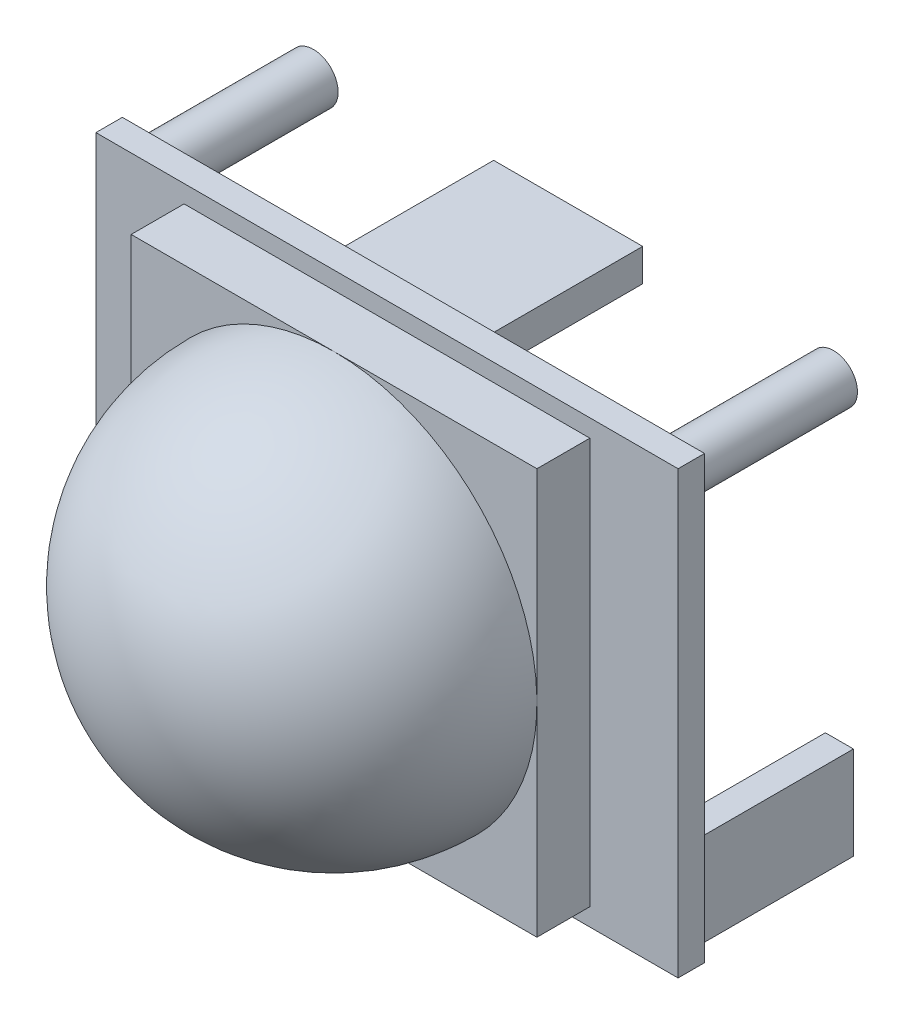
ISO-10303-21;
HEADER;
FILE_DESCRIPTION(('STEP AP214'),'2;1');
FILE_NAME('part.step','',(''),(''),'','','');
FILE_SCHEMA(('AUTOMOTIVE_DESIGN { 1 0 10303 214 1 1 1 1 }'));
ENDSEC;
DATA;
#1=APPLICATION_CONTEXT('core data for automotive mechanical design processes');
#2=APPLICATION_PROTOCOL_DEFINITION('international standard','automotive_design',2000,#1);
#3=PRODUCT_CONTEXT('',#1,'mechanical');
#4=PRODUCT('Part','Part','',(#3));
#5=PRODUCT_RELATED_PRODUCT_CATEGORY('part','',(#4));
#6=PRODUCT_DEFINITION_FORMATION('','',#4);
#7=PRODUCT_DEFINITION_CONTEXT('part definition',#1,'design');
#8=PRODUCT_DEFINITION('design','',#6,#7);
#9=PRODUCT_DEFINITION_SHAPE('','',#8);
#10=(LENGTH_UNIT() NAMED_UNIT(*) SI_UNIT(.MILLI.,.METRE.));
#11=(NAMED_UNIT(*) PLANE_ANGLE_UNIT() SI_UNIT($,.RADIAN.));
#12=(NAMED_UNIT(*) SI_UNIT($,.STERADIAN.) SOLID_ANGLE_UNIT());
#13=UNCERTAINTY_MEASURE_WITH_UNIT(LENGTH_MEASURE(1.E-05),#10,'distance_accuracy_value','');
#14=(GEOMETRIC_REPRESENTATION_CONTEXT(3) GLOBAL_UNCERTAINTY_ASSIGNED_CONTEXT((#13)) GLOBAL_UNIT_ASSIGNED_CONTEXT((#10,
#11,#12)) REPRESENTATION_CONTEXT('',''));
#15=CARTESIAN_POINT('',(0.,0.,0.));
#16=DIRECTION('',(0.,0.,1.));
#17=DIRECTION('',(1.,0.,0.));
#18=AXIS2_PLACEMENT_3D('',#15,#16,#17);
#19=CARTESIAN_POINT('',(0.,0.,13.5378110188714));
#20=DIRECTION('',(0.,0.,-1.));
#21=DIRECTION('',(-1.,0.,0.));
#22=AXIS2_PLACEMENT_3D('',#19,#20,#21);
#23=CONICAL_SURFACE('',#22,0.,1.56750842395822);
#24=CARTESIAN_POINT('',(0.,0.,13.5));
#25=DIRECTION('',(0.,0.,-1.));
#26=DIRECTION('',(-1.,0.,0.));
#27=AXIS2_PLACEMENT_3D('',#24,#25,#26);
#28=CIRCLE('',#27,11.5);
#29=CARTESIAN_POINT('',(-11.5,0.,13.5));
#30=VERTEX_POINT('',#29);
#31=EDGE_CURVE('E12',#30,#30,#28,.T.);
#32=ORIENTED_EDGE('',*,*,#31,.T.);
#33=EDGE_LOOP('',(#32));
#34=FACE_BOUND('',#33,.T.);
#35=CARTESIAN_POINT('',(0.,0.,13.5378110188714));
#36=VERTEX_POINT('',#35);
#37=VERTEX_LOOP('',#36);
#38=FACE_BOUND('',#37,.T.);
#39=ADVANCED_FACE('F47',(#34,#38),#23,.F.);
#40=CARTESIAN_POINT('',(0.,0.,13.5378110188714));
#41=DIRECTION('',(0.,0.,-1.));
#42=DIRECTION('',(0.,1.,0.));
#43=AXIS2_PLACEMENT_3D('',#40,#41,#42);
#44=SPHERICAL_SURFACE('',#43,11.5000621595341);
#45=ORIENTED_EDGE('',*,*,#31,.F.);
#46=EDGE_LOOP('',(#45));
#47=FACE_BOUND('',#46,.T.);
#48=ADVANCED_FACE('F55',(#47),#44,.T.);
#49=CLOSED_SHELL('',(#39,#48));
#50=MANIFOLD_SOLID_BREP('B2',#49);
#51=CARTESIAN_POINT('',(16.5,12.5,10.5));
#52=DIRECTION('',(-1.,0.,0.));
#53=DIRECTION('',(0.,-1.,0.));
#54=AXIS2_PLACEMENT_3D('',#51,#52,#53);
#55=PLANE('',#54);
#56=DIRECTION('',(0.,-1.,0.));
#57=VECTOR('',#56,1.);
#58=CARTESIAN_POINT('',(16.5,12.5,9.));
#59=LINE('',#58,#57);
#60=CARTESIAN_POINT('',(16.5,12.5,9.));
#61=VERTEX_POINT('',#60);
#62=CARTESIAN_POINT('',(16.5,-12.5,9.));
#63=VERTEX_POINT('',#62);
#64=EDGE_CURVE('E89',#61,#63,#59,.T.);
#65=ORIENTED_EDGE('',*,*,#64,.F.);
#66=DIRECTION('',(0.,0.,-1.));
#67=VECTOR('',#66,1.);
#68=CARTESIAN_POINT('',(16.5,12.5,10.5));
#69=LINE('',#68,#67);
#70=CARTESIAN_POINT('',(16.5,12.5,10.5));
#71=VERTEX_POINT('',#70);
#72=EDGE_CURVE('E45',#71,#61,#69,.T.);
#73=ORIENTED_EDGE('',*,*,#72,.F.);
#74=DIRECTION('',(0.,1.,0.));
#75=VECTOR('',#74,1.);
#76=CARTESIAN_POINT('',(16.5,12.5,10.5));
#77=LINE('',#76,#75);
#78=CARTESIAN_POINT('',(16.5,-12.5,10.5));
#79=VERTEX_POINT('',#78);
#80=EDGE_CURVE('E440',#79,#71,#77,.T.);
#81=ORIENTED_EDGE('',*,*,#80,.F.);
#82=DIRECTION('',(0.,0.,-1.));
#83=VECTOR('',#82,1.);
#84=CARTESIAN_POINT('',(16.5,-12.5,10.5));
#85=LINE('',#84,#83);
#86=EDGE_CURVE('E449',#79,#63,#85,.T.);
#87=ORIENTED_EDGE('',*,*,#86,.T.);
#88=EDGE_LOOP('',(#65,#73,#81,#87));
#89=FACE_BOUND('',#88,.T.);
#90=ADVANCED_FACE('F75',(#89),#55,.F.);
#91=CARTESIAN_POINT('',(-16.5,12.5,10.5));
#92=DIRECTION('',(0.,-1.,0.));
#93=DIRECTION('',(0.,0.,-1.));
#94=AXIS2_PLACEMENT_3D('',#91,#92,#93);
#95=PLANE('',#94);
#96=DIRECTION('',(1.,0.,0.));
#97=VECTOR('',#96,1.);
#98=CARTESIAN_POINT('',(16.5,12.5,9.));
#99=LINE('',#98,#97);
#100=CARTESIAN_POINT('',(-16.5,12.5,9.));
#101=VERTEX_POINT('',#100);
#102=EDGE_CURVE('E405',#101,#61,#99,.T.);
#103=ORIENTED_EDGE('',*,*,#102,.F.);
#104=DIRECTION('',(0.,0.,-1.));
#105=VECTOR('',#104,1.);
#106=CARTESIAN_POINT('',(-16.5,12.5,10.5));
#107=LINE('',#106,#105);
#108=CARTESIAN_POINT('',(-16.5,12.5,10.5));
#109=VERTEX_POINT('',#108);
#110=EDGE_CURVE('E82',#109,#101,#107,.T.);
#111=ORIENTED_EDGE('',*,*,#110,.F.);
#112=DIRECTION('',(-1.,0.,0.));
#113=VECTOR('',#112,1.);
#114=CARTESIAN_POINT('',(-16.5,12.5,10.5));
#115=LINE('',#114,#113);
#116=EDGE_CURVE('E443',#71,#109,#115,.T.);
#117=ORIENTED_EDGE('',*,*,#116,.F.);
#118=ORIENTED_EDGE('',*,*,#72,.T.);
#119=EDGE_LOOP('',(#103,#111,#117,#118));
#120=FACE_BOUND('',#119,.T.);
#121=ADVANCED_FACE('F463',(#120),#95,.F.);
#122=CARTESIAN_POINT('',(-16.5,12.5,10.5));
#123=DIRECTION('',(1.,0.,0.));
#124=DIRECTION('',(0.,1.,0.));
#125=AXIS2_PLACEMENT_3D('',#122,#123,#124);
#126=PLANE('',#125);
#127=DIRECTION('',(0.,1.,0.));
#128=VECTOR('',#127,1.);
#129=CARTESIAN_POINT('',(-16.5,12.5,9.));
#130=LINE('',#129,#128);
#131=CARTESIAN_POINT('',(-16.5,-12.5,9.));
#132=VERTEX_POINT('',#131);
#133=EDGE_CURVE('E403',#132,#101,#130,.T.);
#134=ORIENTED_EDGE('',*,*,#133,.F.);
#135=DIRECTION('',(0.,0.,-1.));
#136=VECTOR('',#135,1.);
#137=CARTESIAN_POINT('',(-16.5,-12.5,10.5));
#138=LINE('',#137,#136);
#139=CARTESIAN_POINT('',(-16.5,-12.5,10.5));
#140=VERTEX_POINT('',#139);
#141=EDGE_CURVE('E452',#140,#132,#138,.T.);
#142=ORIENTED_EDGE('',*,*,#141,.F.);
#143=DIRECTION('',(0.,-1.,0.));
#144=VECTOR('',#143,1.);
#145=CARTESIAN_POINT('',(-16.5,12.5,10.5));
#146=LINE('',#145,#144);
#147=EDGE_CURVE('E445',#109,#140,#146,.T.);
#148=ORIENTED_EDGE('',*,*,#147,.F.);
#149=ORIENTED_EDGE('',*,*,#110,.T.);
#150=EDGE_LOOP('',(#134,#142,#148,#149));
#151=FACE_BOUND('',#150,.T.);
#152=ADVANCED_FACE('F459',(#151),#126,.F.);
#153=CARTESIAN_POINT('',(-16.5,-12.5,10.5));
#154=DIRECTION('',(0.,1.,0.));
#155=DIRECTION('',(0.,0.,1.));
#156=AXIS2_PLACEMENT_3D('',#153,#154,#155);
#157=PLANE('',#156);
#158=DIRECTION('',(-1.,0.,0.));
#159=VECTOR('',#158,1.);
#160=CARTESIAN_POINT('',(16.5,-12.5,9.));
#161=LINE('',#160,#159);
#162=EDGE_CURVE('E401',#63,#132,#161,.T.);
#163=ORIENTED_EDGE('',*,*,#162,.F.);
#164=ORIENTED_EDGE('',*,*,#86,.F.);
#165=DIRECTION('',(1.,0.,0.));
#166=VECTOR('',#165,1.);
#167=CARTESIAN_POINT('',(-16.5,-12.5,10.5));
#168=LINE('',#167,#166);
#169=EDGE_CURVE('E447',#140,#79,#168,.T.);
#170=ORIENTED_EDGE('',*,*,#169,.F.);
#171=ORIENTED_EDGE('',*,*,#141,.T.);
#172=EDGE_LOOP('',(#163,#164,#170,#171));
#173=FACE_BOUND('',#172,.T.);
#174=ADVANCED_FACE('F470',(#173),#157,.F.);
#175=CARTESIAN_POINT('',(0.,0.,10.5));
#176=DIRECTION('',(0.,0.,1.));
#177=DIRECTION('',(1.,0.,0.));
#178=AXIS2_PLACEMENT_3D('',#175,#176,#177);
#179=PLANE('',#178);
#180=DIRECTION('',(0.,1.,0.));
#181=VECTOR('',#180,1.);
#182=CARTESIAN_POINT('',(11.5,11.5,10.5));
#183=LINE('',#182,#181);
#184=CARTESIAN_POINT('',(11.5,-11.5,10.5));
#185=VERTEX_POINT('',#184);
#186=CARTESIAN_POINT('',(11.5,11.5,10.5));
#187=VERTEX_POINT('',#186);
#188=EDGE_CURVE('E407',#185,#187,#183,.T.);
#189=ORIENTED_EDGE('',*,*,#188,.F.);
#190=DIRECTION('',(1.,0.,0.));
#191=VECTOR('',#190,1.);
#192=CARTESIAN_POINT('',(-11.5,-11.5,10.5));
#193=LINE('',#192,#191);
#194=CARTESIAN_POINT('',(-11.5,-11.5,10.5));
#195=VERTEX_POINT('',#194);
#196=EDGE_CURVE('E412',#195,#185,#193,.T.);
#197=ORIENTED_EDGE('',*,*,#196,.F.);
#198=DIRECTION('',(0.,-1.,0.));
#199=VECTOR('',#198,1.);
#200=CARTESIAN_POINT('',(-11.5,11.5,10.5));
#201=LINE('',#200,#199);
#202=CARTESIAN_POINT('',(-11.5,11.5,10.5));
#203=VERTEX_POINT('',#202);
#204=EDGE_CURVE('E424',#203,#195,#201,.T.);
#205=ORIENTED_EDGE('',*,*,#204,.F.);
#206=DIRECTION('',(-1.,0.,0.));
#207=VECTOR('',#206,1.);
#208=CARTESIAN_POINT('',(-11.5,11.5,10.5));
#209=LINE('',#208,#207);
#210=EDGE_CURVE('E421',#187,#203,#209,.T.);
#211=ORIENTED_EDGE('',*,*,#210,.F.);
#212=EDGE_LOOP('',(#189,#197,#205,#211));
#213=FACE_BOUND('',#212,.T.);
#214=ORIENTED_EDGE('',*,*,#80,.T.);
#215=ORIENTED_EDGE('',*,*,#116,.T.);
#216=ORIENTED_EDGE('',*,*,#147,.T.);
#217=ORIENTED_EDGE('',*,*,#169,.T.);
#218=EDGE_LOOP('',(#214,#215,#216,#217));
#219=FACE_BOUND('',#218,.T.);
#220=ADVANCED_FACE('F472',(#213,#219),#179,.T.);
#221=CARTESIAN_POINT('',(11.5,11.5,13.5));
#222=DIRECTION('',(-1.,0.,0.));
#223=DIRECTION('',(0.,-1.,0.));
#224=AXIS2_PLACEMENT_3D('',#221,#222,#223);
#225=PLANE('',#224);
#226=ORIENTED_EDGE('',*,*,#188,.T.);
#227=DIRECTION('',(0.,0.,-1.));
#228=VECTOR('',#227,1.);
#229=CARTESIAN_POINT('',(11.5,11.5,13.5));
#230=LINE('',#229,#228);
#231=CARTESIAN_POINT('',(11.5,11.5,13.5));
#232=VERTEX_POINT('',#231);
#233=EDGE_CURVE('E437',#232,#187,#230,.T.);
#234=ORIENTED_EDGE('',*,*,#233,.F.);
#235=DIRECTION('',(0.,1.,0.));
#236=VECTOR('',#235,1.);
#237=CARTESIAN_POINT('',(11.5,11.5,13.5));
#238=LINE('',#237,#236);
#239=CARTESIAN_POINT('',(11.5,-11.5,13.5));
#240=VERTEX_POINT('',#239);
#241=EDGE_CURVE('E408',#240,#232,#238,.T.);
#242=ORIENTED_EDGE('',*,*,#241,.F.);
#243=DIRECTION('',(0.,0.,-1.));
#244=VECTOR('',#243,1.);
#245=CARTESIAN_POINT('',(11.5,-11.5,13.5));
#246=LINE('',#245,#244);
#247=EDGE_CURVE('E418',#240,#185,#246,.T.);
#248=ORIENTED_EDGE('',*,*,#247,.T.);
#249=EDGE_LOOP('',(#226,#234,#242,#248));
#250=FACE_BOUND('',#249,.T.);
#251=ADVANCED_FACE('F474',(#250),#225,.F.);
#252=CARTESIAN_POINT('',(-11.5,11.5,13.5));
#253=DIRECTION('',(0.,-1.,0.));
#254=DIRECTION('',(0.,0.,-1.));
#255=AXIS2_PLACEMENT_3D('',#252,#253,#254);
#256=PLANE('',#255);
#257=ORIENTED_EDGE('',*,*,#210,.T.);
#258=DIRECTION('',(0.,0.,-1.));
#259=VECTOR('',#258,1.);
#260=CARTESIAN_POINT('',(-11.5,11.5,13.5));
#261=LINE('',#260,#259);
#262=CARTESIAN_POINT('',(-11.5,11.5,13.5));
#263=VERTEX_POINT('',#262);
#264=EDGE_CURVE('E434',#263,#203,#261,.T.);
#265=ORIENTED_EDGE('',*,*,#264,.F.);
#266=DIRECTION('',(-1.,0.,0.));
#267=VECTOR('',#266,1.);
#268=CARTESIAN_POINT('',(-11.5,11.5,13.5));
#269=LINE('',#268,#267);
#270=EDGE_CURVE('E411',#232,#263,#269,.T.);
#271=ORIENTED_EDGE('',*,*,#270,.F.);
#272=ORIENTED_EDGE('',*,*,#233,.T.);
#273=EDGE_LOOP('',(#257,#265,#271,#272));
#274=FACE_BOUND('',#273,.T.);
#275=ADVANCED_FACE('F481',(#274),#256,.F.);
#276=CARTESIAN_POINT('',(-11.5,11.5,13.5));
#277=DIRECTION('',(1.,0.,0.));
#278=DIRECTION('',(0.,1.,0.));
#279=AXIS2_PLACEMENT_3D('',#276,#277,#278);
#280=PLANE('',#279);
#281=ORIENTED_EDGE('',*,*,#204,.T.);
#282=DIRECTION('',(0.,0.,-1.));
#283=VECTOR('',#282,1.);
#284=CARTESIAN_POINT('',(-11.5,-11.5,13.5));
#285=LINE('',#284,#283);
#286=CARTESIAN_POINT('',(-11.5,-11.5,13.5));
#287=VERTEX_POINT('',#286);
#288=EDGE_CURVE('E431',#287,#195,#285,.T.);
#289=ORIENTED_EDGE('',*,*,#288,.F.);
#290=DIRECTION('',(0.,-1.,0.));
#291=VECTOR('',#290,1.);
#292=CARTESIAN_POINT('',(-11.5,11.5,13.5));
#293=LINE('',#292,#291);
#294=EDGE_CURVE('E414',#263,#287,#293,.T.);
#295=ORIENTED_EDGE('',*,*,#294,.F.);
#296=ORIENTED_EDGE('',*,*,#264,.T.);
#297=EDGE_LOOP('',(#281,#289,#295,#296));
#298=FACE_BOUND('',#297,.T.);
#299=ADVANCED_FACE('F531',(#298),#280,.F.);
#300=CARTESIAN_POINT('',(-11.5,-11.5,13.5));
#301=DIRECTION('',(0.,1.,0.));
#302=DIRECTION('',(0.,0.,1.));
#303=AXIS2_PLACEMENT_3D('',#300,#301,#302);
#304=PLANE('',#303);
#305=ORIENTED_EDGE('',*,*,#196,.T.);
#306=ORIENTED_EDGE('',*,*,#247,.F.);
#307=DIRECTION('',(1.,0.,0.));
#308=VECTOR('',#307,1.);
#309=CARTESIAN_POINT('',(-11.5,-11.5,13.5));
#310=LINE('',#309,#308);
#311=EDGE_CURVE('E416',#287,#240,#310,.T.);
#312=ORIENTED_EDGE('',*,*,#311,.F.);
#313=ORIENTED_EDGE('',*,*,#288,.T.);
#314=EDGE_LOOP('',(#305,#306,#312,#313));
#315=FACE_BOUND('',#314,.T.);
#316=ADVANCED_FACE('F527',(#315),#304,.F.);
#317=CARTESIAN_POINT('',(0.,0.,13.5));
#318=DIRECTION('',(0.,0.,1.));
#319=DIRECTION('',(1.,0.,0.));
#320=AXIS2_PLACEMENT_3D('',#317,#318,#319);
#321=PLANE('',#320);
#322=ORIENTED_EDGE('',*,*,#241,.T.);
#323=ORIENTED_EDGE('',*,*,#270,.T.);
#324=ORIENTED_EDGE('',*,*,#294,.T.);
#325=ORIENTED_EDGE('',*,*,#311,.T.);
#326=EDGE_LOOP('',(#322,#323,#324,#325));
#327=FACE_BOUND('',#326,.T.);
#328=ADVANCED_FACE('F521',(#327),#321,.T.);
#329=CARTESIAN_POINT('',(0.,0.,9.));
#330=DIRECTION('',(0.,0.,-1.));
#331=DIRECTION('',(-1.,0.,0.));
#332=AXIS2_PLACEMENT_3D('',#329,#330,#331);
#333=PLANE('',#332);
#334=DIRECTION('',(1.,0.,0.));
#335=VECTOR('',#334,1.);
#336=CARTESIAN_POINT('',(-2.86304816678649,-9.41978193146409,9.));
#337=LINE('',#336,#335);
#338=CARTESIAN_POINT('',(-8.55379822669543,-9.41978193146409,9.));
#339=VERTEX_POINT('',#338);
#340=CARTESIAN_POINT('',(-2.86304816678649,-9.41978193146409,9.));
#341=VERTEX_POINT('',#340);
#342=EDGE_CURVE('E248',#339,#341,#337,.T.);
#343=ORIENTED_EDGE('',*,*,#342,.F.);
#344=DIRECTION('',(0.,1.,0.));
#345=VECTOR('',#344,1.);
#346=CARTESIAN_POINT('',(-8.55379822669543,-9.41978193146409,9.));
#347=LINE('',#346,#345);
#348=CARTESIAN_POINT('',(-8.55379822669543,-11.66427030913,9.));
#349=VERTEX_POINT('',#348);
#350=EDGE_CURVE('E258',#349,#339,#347,.T.);
#351=ORIENTED_EDGE('',*,*,#350,.F.);
#352=DIRECTION('',(-1.,0.,0.));
#353=VECTOR('',#352,1.);
#354=CARTESIAN_POINT('',(-2.86304816678649,-11.66427030913,9.));
#355=LINE('',#354,#353);
#356=CARTESIAN_POINT('',(-2.86304816678649,-11.66427030913,9.));
#357=VERTEX_POINT('',#356);
#358=EDGE_CURVE('E240',#357,#349,#355,.T.);
#359=ORIENTED_EDGE('',*,*,#358,.F.);
#360=DIRECTION('',(0.,-1.,0.));
#361=VECTOR('',#360,1.);
#362=CARTESIAN_POINT('',(-2.86304816678649,-9.41978193146409,9.));
#363=LINE('',#362,#361);
#364=EDGE_CURVE('E255',#341,#357,#363,.T.);
#365=ORIENTED_EDGE('',*,*,#364,.F.);
#366=EDGE_LOOP('',(#343,#351,#359,#365));
#367=FACE_BOUND('',#366,.T.);
#368=DIRECTION('',(1.,0.,0.));
#369=VECTOR('',#368,1.);
#370=CARTESIAN_POINT('',(5.40797987059669,-9.41978193146409,9.));
#371=LINE('',#370,#369);
#372=CARTESIAN_POINT('',(-0.706925473280613,-9.41978193146409,9.));
#373=VERTEX_POINT('',#372);
#374=CARTESIAN_POINT('',(5.40797987059669,-9.41978193146409,9.));
#375=VERTEX_POINT('',#374);
#376=EDGE_CURVE('E291',#373,#375,#371,.T.);
#377=ORIENTED_EDGE('',*,*,#376,.F.);
#378=DIRECTION('',(0.,1.,0.));
#379=VECTOR('',#378,1.);
#380=CARTESIAN_POINT('',(-0.706925473280613,-9.41978193146409,9.));
#381=LINE('',#380,#379);
#382=CARTESIAN_POINT('',(-0.706925473280613,-11.66427030913,9.));
#383=VERTEX_POINT('',#382);
#384=EDGE_CURVE('E288',#383,#373,#381,.T.);
#385=ORIENTED_EDGE('',*,*,#384,.F.);
#386=DIRECTION('',(-1.,0.,0.));
#387=VECTOR('',#386,1.);
#388=CARTESIAN_POINT('',(5.40797987059669,-11.66427030913,9.));
#389=LINE('',#388,#387);
#390=CARTESIAN_POINT('',(5.40797987059669,-11.66427030913,9.));
#391=VERTEX_POINT('',#390);
#392=EDGE_CURVE('E284',#391,#383,#389,.T.);
#393=ORIENTED_EDGE('',*,*,#392,.F.);
#394=DIRECTION('',(0.,-1.,0.));
#395=VECTOR('',#394,1.);
#396=CARTESIAN_POINT('',(5.40797987059669,-9.41978193146409,9.));
#397=LINE('',#396,#395);
#398=EDGE_CURVE('E281',#375,#391,#397,.T.);
#399=ORIENTED_EDGE('',*,*,#398,.F.);
#400=EDGE_LOOP('',(#377,#385,#393,#399));
#401=FACE_BOUND('',#400,.T.);
#402=DIRECTION('',(1.,0.,0.));
#403=VECTOR('',#402,1.);
#404=CARTESIAN_POINT('',(3.99412892403547,11.9116942247784,9.));
#405=LINE('',#404,#403);
#406=CARTESIAN_POINT('',(-4.45363048166787,11.9116942247784,9.));
#407=VERTEX_POINT('',#406);
#408=CARTESIAN_POINT('',(3.99412892403547,11.9116942247784,9.));
#409=VERTEX_POINT('',#408);
#410=EDGE_CURVE('E324',#407,#409,#405,.T.);
#411=ORIENTED_EDGE('',*,*,#410,.F.);
#412=DIRECTION('',(0.,1.,0.));
#413=VECTOR('',#412,1.);
#414=CARTESIAN_POINT('',(-4.45363048166787,11.9116942247784,9.));
#415=LINE('',#414,#413);
#416=CARTESIAN_POINT('',(-4.45363048166787,10.0736879942488,9.));
#417=VERTEX_POINT('',#416);
#418=EDGE_CURVE('E321',#417,#407,#415,.T.);
#419=ORIENTED_EDGE('',*,*,#418,.F.);
#420=DIRECTION('',(-1.,0.,0.));
#421=VECTOR('',#420,1.);
#422=CARTESIAN_POINT('',(3.99412892403547,10.0736879942488,9.));
#423=LINE('',#422,#421);
#424=CARTESIAN_POINT('',(3.99412892403547,10.0736879942488,9.));
#425=VERTEX_POINT('',#424);
#426=EDGE_CURVE('E317',#425,#417,#423,.T.);
#427=ORIENTED_EDGE('',*,*,#426,.F.);
#428=DIRECTION('',(0.,-1.,0.));
#429=VECTOR('',#428,1.);
#430=CARTESIAN_POINT('',(3.99412892403547,11.9116942247784,9.));
#431=LINE('',#430,#429);
#432=EDGE_CURVE('E314',#409,#425,#431,.T.);
#433=ORIENTED_EDGE('',*,*,#432,.F.);
#434=EDGE_LOOP('',(#411,#419,#427,#433));
#435=FACE_BOUND('',#434,.T.);
#436=DIRECTION('',(1.,0.,0.));
#437=VECTOR('',#436,1.);
#438=CARTESIAN_POINT('',(15.9411694224778,-6.78648454349381,9.));
#439=LINE('',#438,#437);
#440=CARTESIAN_POINT('',(14.3505871075965,-6.78648454349381,9.));
#441=VERTEX_POINT('',#440);
#442=CARTESIAN_POINT('',(15.9411694224778,-6.78648454349381,9.));
#443=VERTEX_POINT('',#442);
#444=EDGE_CURVE('E357',#441,#443,#439,.T.);
#445=ORIENTED_EDGE('',*,*,#444,.F.);
#446=DIRECTION('',(0.,1.,0.));
#447=VECTOR('',#446,1.);
#448=CARTESIAN_POINT('',(14.3505871075965,-6.78648454349381,9.));
#449=LINE('',#448,#447);
#450=CARTESIAN_POINT('',(14.3505871075965,-12.0530793194344,9.));
#451=VERTEX_POINT('',#450);
#452=EDGE_CURVE('E354',#451,#441,#449,.T.);
#453=ORIENTED_EDGE('',*,*,#452,.F.);
#454=DIRECTION('',(-1.,0.,0.));
#455=VECTOR('',#454,1.);
#456=CARTESIAN_POINT('',(15.9411694224778,-12.0530793194344,9.));
#457=LINE('',#456,#455);
#458=CARTESIAN_POINT('',(15.9411694224778,-12.0530793194344,9.));
#459=VERTEX_POINT('',#458);
#460=EDGE_CURVE('E350',#459,#451,#457,.T.);
#461=ORIENTED_EDGE('',*,*,#460,.F.);
#462=DIRECTION('',(0.,-1.,0.));
#463=VECTOR('',#462,1.);
#464=CARTESIAN_POINT('',(15.9411694224778,-6.78648454349381,9.));
#465=LINE('',#464,#463);
#466=EDGE_CURVE('E347',#443,#459,#465,.T.);
#467=ORIENTED_EDGE('',*,*,#466,.F.);
#468=EDGE_LOOP('',(#445,#453,#461,#467));
#469=FACE_BOUND('',#468,.T.);
#470=CARTESIAN_POINT('',(-14.6687035705727,-10.9219985621854,9.));
#471=DIRECTION('',(0.,0.,-1.));
#472=DIRECTION('',(-1.,0.,0.));
#473=AXIS2_PLACEMENT_3D('',#470,#471,#472);
#474=CIRCLE('',#473,1.35057922034271);
#475=CARTESIAN_POINT('',(-16.0192827909154,-10.9219985621854,9.));
#476=VERTEX_POINT('',#475);
#477=EDGE_CURVE('E377',#476,#476,#474,.T.);
#478=ORIENTED_EDGE('',*,*,#477,.F.);
#479=EDGE_LOOP('',(#478));
#480=FACE_BOUND('',#479,.T.);
#481=CARTESIAN_POINT('',(12.5832734243949,-10.9926911095135,9.));
#482=DIRECTION('',(0.,0.,-1.));
#483=DIRECTION('',(-1.,0.,0.));
#484=AXIS2_PLACEMENT_3D('',#481,#482,#483);
#485=CIRCLE('',#484,1.3338243153399);
#486=CARTESIAN_POINT('',(11.249449109055,-10.9926911095135,9.));
#487=VERTEX_POINT('',#486);
#488=EDGE_CURVE('E383',#487,#487,#485,.T.);
#489=ORIENTED_EDGE('',*,*,#488,.F.);
#490=EDGE_LOOP('',(#489));
#491=FACE_BOUND('',#490,.T.);
#492=CARTESIAN_POINT('',(-14.6687035705727,10.8513060148575,9.));
#493=DIRECTION('',(0.,0.,-1.));
#494=DIRECTION('',(-1.,0.,0.));
#495=AXIS2_PLACEMENT_3D('',#492,#493,#494);
#496=CIRCLE('',#495,1.39964102866064);
#497=CARTESIAN_POINT('',(-16.0683445992334,10.8513060148575,9.));
#498=VERTEX_POINT('',#497);
#499=EDGE_CURVE('E389',#498,#498,#496,.T.);
#500=ORIENTED_EDGE('',*,*,#499,.F.);
#501=EDGE_LOOP('',(#500));
#502=FACE_BOUND('',#501,.T.);
#503=CARTESIAN_POINT('',(14.8100886652289,10.8513060148575,9.));
#504=DIRECTION('',(0.,0.,-1.));
#505=DIRECTION('',(-1.,0.,0.));
#506=AXIS2_PLACEMENT_3D('',#503,#504,#505);
#507=CIRCLE('',#506,1.35795948960654);
#508=CARTESIAN_POINT('',(13.4521291756223,10.8513060148575,9.));
#509=VERTEX_POINT('',#508);
#510=EDGE_CURVE('E395',#509,#509,#507,.T.);
#511=ORIENTED_EDGE('',*,*,#510,.F.);
#512=EDGE_LOOP('',(#511));
#513=FACE_BOUND('',#512,.T.);
#514=ORIENTED_EDGE('',*,*,#64,.T.);
#515=ORIENTED_EDGE('',*,*,#162,.T.);
#516=ORIENTED_EDGE('',*,*,#133,.T.);
#517=ORIENTED_EDGE('',*,*,#102,.T.);
#518=EDGE_LOOP('',(#514,#515,#516,#517));
#519=FACE_BOUND('',#518,.T.);
#520=ADVANCED_FACE('F253',(#367,#401,#435,#469,#480,#491,#502,#513,#519),#333,.T.);
#521=CARTESIAN_POINT('',(14.8100886652289,10.8513060148575,9.));
#522=DIRECTION('',(0.,0.,-1.));
#523=DIRECTION('',(-1.,0.,0.));
#524=AXIS2_PLACEMENT_3D('',#521,#522,#523);
#525=CYLINDRICAL_SURFACE('',#524,1.35795948960654);
#526=ORIENTED_EDGE('',*,*,#510,.T.);
#527=EDGE_LOOP('',(#526));
#528=FACE_BOUND('',#527,.T.);
#529=CARTESIAN_POINT('',(14.8100886652289,10.8513060148575,0.));
#530=DIRECTION('',(0.,0.,-1.));
#531=DIRECTION('',(-1.,0.,0.));
#532=AXIS2_PLACEMENT_3D('',#529,#530,#531);
#533=CIRCLE('',#532,1.35795948960654);
#534=CARTESIAN_POINT('',(13.4521291756223,10.8513060148575,0.));
#535=VERTEX_POINT('',#534);
#536=EDGE_CURVE('E392',#535,#535,#533,.T.);
#537=ORIENTED_EDGE('',*,*,#536,.F.);
#538=EDGE_LOOP('',(#537));
#539=FACE_BOUND('',#538,.T.);
#540=ADVANCED_FACE('F509',(#528,#539),#525,.T.);
#541=CARTESIAN_POINT('',(-14.6687035705727,10.8513060148575,9.));
#542=DIRECTION('',(0.,0.,-1.));
#543=DIRECTION('',(-1.,0.,0.));
#544=AXIS2_PLACEMENT_3D('',#541,#542,#543);
#545=CYLINDRICAL_SURFACE('',#544,1.39964102866064);
#546=ORIENTED_EDGE('',*,*,#499,.T.);
#547=EDGE_LOOP('',(#546));
#548=FACE_BOUND('',#547,.T.);
#549=CARTESIAN_POINT('',(-14.6687035705727,10.8513060148575,0.));
#550=DIRECTION('',(0.,0.,-1.));
#551=DIRECTION('',(-1.,0.,0.));
#552=AXIS2_PLACEMENT_3D('',#549,#550,#551);
#553=CIRCLE('',#552,1.39964102866064);
#554=CARTESIAN_POINT('',(-16.0683445992334,10.8513060148575,0.));
#555=VERTEX_POINT('',#554);
#556=EDGE_CURVE('E386',#555,#555,#553,.T.);
#557=ORIENTED_EDGE('',*,*,#556,.F.);
#558=EDGE_LOOP('',(#557));
#559=FACE_BOUND('',#558,.T.);
#560=ADVANCED_FACE('F511',(#548,#559),#545,.T.);
#561=CARTESIAN_POINT('',(12.5832734243949,-10.9926911095135,9.));
#562=DIRECTION('',(0.,0.,-1.));
#563=DIRECTION('',(-1.,0.,0.));
#564=AXIS2_PLACEMENT_3D('',#561,#562,#563);
#565=CYLINDRICAL_SURFACE('',#564,1.3338243153399);
#566=ORIENTED_EDGE('',*,*,#488,.T.);
#567=EDGE_LOOP('',(#566));
#568=FACE_BOUND('',#567,.T.);
#569=CARTESIAN_POINT('',(12.5832734243949,-10.9926911095135,0.));
#570=DIRECTION('',(0.,0.,-1.));
#571=DIRECTION('',(-1.,0.,0.));
#572=AXIS2_PLACEMENT_3D('',#569,#570,#571);
#573=CIRCLE('',#572,1.3338243153399);
#574=CARTESIAN_POINT('',(11.249449109055,-10.9926911095135,0.));
#575=VERTEX_POINT('',#574);
#576=EDGE_CURVE('E380',#575,#575,#573,.T.);
#577=ORIENTED_EDGE('',*,*,#576,.F.);
#578=EDGE_LOOP('',(#577));
#579=FACE_BOUND('',#578,.T.);
#580=ADVANCED_FACE('F518',(#568,#579),#565,.T.);
#581=CARTESIAN_POINT('',(-14.6687035705727,-10.9219985621854,9.));
#582=DIRECTION('',(0.,0.,-1.));
#583=DIRECTION('',(-1.,0.,0.));
#584=AXIS2_PLACEMENT_3D('',#581,#582,#583);
#585=CYLINDRICAL_SURFACE('',#584,1.35057922034271);
#586=ORIENTED_EDGE('',*,*,#477,.T.);
#587=EDGE_LOOP('',(#586));
#588=FACE_BOUND('',#587,.T.);
#589=CARTESIAN_POINT('',(-14.6687035705727,-10.9219985621854,0.));
#590=DIRECTION('',(0.,0.,-1.));
#591=DIRECTION('',(-1.,0.,0.));
#592=AXIS2_PLACEMENT_3D('',#589,#590,#591);
#593=CIRCLE('',#592,1.35057922034271);
#594=CARTESIAN_POINT('',(-16.0192827909154,-10.9219985621854,0.));
#595=VERTEX_POINT('',#594);
#596=EDGE_CURVE('E371',#595,#595,#593,.T.);
#597=ORIENTED_EDGE('',*,*,#596,.F.);
#598=EDGE_LOOP('',(#597));
#599=FACE_BOUND('',#598,.T.);
#600=ADVANCED_FACE('F589',(#588,#599),#585,.T.);
#601=CARTESIAN_POINT('',(15.9411694224778,-6.78648454349381,9.));
#602=DIRECTION('',(1.,0.,0.));
#603=DIRECTION('',(0.,0.,-1.));
#604=AXIS2_PLACEMENT_3D('',#601,#602,#603);
#605=PLANE('',#604);
#606=DIRECTION('',(0.,-1.,0.));
#607=VECTOR('',#606,1.);
#608=CARTESIAN_POINT('',(15.9411694224778,-6.78648454349381,0.));
#609=LINE('',#608,#607);
#610=CARTESIAN_POINT('',(15.9411694224778,-6.78648454349381,0.));
#611=VERTEX_POINT('',#610);
#612=CARTESIAN_POINT('',(15.9411694224778,-12.0530793194344,0.));
#613=VERTEX_POINT('',#612);
#614=EDGE_CURVE('E340',#611,#613,#609,.T.);
#615=ORIENTED_EDGE('',*,*,#614,.F.);
#616=DIRECTION('',(0.,0.,-1.));
#617=VECTOR('',#616,1.);
#618=CARTESIAN_POINT('',(15.9411694224778,-6.78648454349381,9.));
#619=LINE('',#618,#617);
#620=EDGE_CURVE('E369',#443,#611,#619,.T.);
#621=ORIENTED_EDGE('',*,*,#620,.F.);
#622=ORIENTED_EDGE('',*,*,#466,.T.);
#623=DIRECTION('',(0.,0.,-1.));
#624=VECTOR('',#623,1.);
#625=CARTESIAN_POINT('',(15.9411694224778,-12.0530793194344,9.));
#626=LINE('',#625,#624);
#627=EDGE_CURVE('E360',#459,#613,#626,.T.);
#628=ORIENTED_EDGE('',*,*,#627,.T.);
#629=EDGE_LOOP('',(#615,#621,#622,#628));
#630=FACE_BOUND('',#629,.T.);
#631=ADVANCED_FACE('F598',(#630),#605,.T.);
#632=CARTESIAN_POINT('',(15.9411694224778,-6.78648454349381,9.));
#633=DIRECTION('',(0.,1.,0.));
#634=DIRECTION('',(0.,0.,1.));
#635=AXIS2_PLACEMENT_3D('',#632,#633,#634);
#636=PLANE('',#635);
#637=DIRECTION('',(1.,0.,0.));
#638=VECTOR('',#637,1.);
#639=CARTESIAN_POINT('',(15.9411694224778,-6.78648454349381,0.));
#640=LINE('',#639,#638);
#641=CARTESIAN_POINT('',(14.3505871075965,-6.78648454349381,0.));
#642=VERTEX_POINT('',#641);
#643=EDGE_CURVE('E351',#642,#611,#640,.T.);
#644=ORIENTED_EDGE('',*,*,#643,.F.);
#645=DIRECTION('',(0.,0.,-1.));
#646=VECTOR('',#645,1.);
#647=CARTESIAN_POINT('',(14.3505871075965,-6.78648454349381,9.));
#648=LINE('',#647,#646);
#649=EDGE_CURVE('E372',#441,#642,#648,.T.);
#650=ORIENTED_EDGE('',*,*,#649,.F.);
#651=ORIENTED_EDGE('',*,*,#444,.T.);
#652=ORIENTED_EDGE('',*,*,#620,.T.);
#653=EDGE_LOOP('',(#644,#650,#651,#652));
#654=FACE_BOUND('',#653,.T.);
#655=ADVANCED_FACE('F608',(#654),#636,.T.);
#656=CARTESIAN_POINT('',(14.3505871075965,-6.78648454349381,9.));
#657=DIRECTION('',(-1.,0.,0.));
#658=DIRECTION('',(0.,0.,1.));
#659=AXIS2_PLACEMENT_3D('',#656,#657,#658);
#660=PLANE('',#659);
#661=DIRECTION('',(0.,1.,0.));
#662=VECTOR('',#661,1.);
#663=CARTESIAN_POINT('',(14.3505871075965,-6.78648454349381,0.));
#664=LINE('',#663,#662);
#665=CARTESIAN_POINT('',(14.3505871075965,-12.0530793194344,0.));
#666=VERTEX_POINT('',#665);
#667=EDGE_CURVE('E97',#666,#642,#664,.T.);
#668=ORIENTED_EDGE('',*,*,#667,.F.);
#669=DIRECTION('',(0.,0.,-1.));
#670=VECTOR('',#669,1.);
#671=CARTESIAN_POINT('',(14.3505871075965,-12.0530793194344,9.));
#672=LINE('',#671,#670);
#673=EDGE_CURVE('E374',#451,#666,#672,.T.);
#674=ORIENTED_EDGE('',*,*,#673,.F.);
#675=ORIENTED_EDGE('',*,*,#452,.T.);
#676=ORIENTED_EDGE('',*,*,#649,.T.);
#677=EDGE_LOOP('',(#668,#674,#675,#676));
#678=FACE_BOUND('',#677,.T.);
#679=ADVANCED_FACE('F618',(#678),#660,.T.);
#680=CARTESIAN_POINT('',(15.9411694224778,-12.0530793194344,9.));
#681=DIRECTION('',(0.,-1.,0.));
#682=DIRECTION('',(0.,0.,-1.));
#683=AXIS2_PLACEMENT_3D('',#680,#681,#682);
#684=PLANE('',#683);
#685=DIRECTION('',(-1.,0.,0.));
#686=VECTOR('',#685,1.);
#687=CARTESIAN_POINT('',(15.9411694224778,-12.0530793194344,0.));
#688=LINE('',#687,#686);
#689=EDGE_CURVE('E363',#613,#666,#688,.T.);
#690=ORIENTED_EDGE('',*,*,#689,.F.);
#691=ORIENTED_EDGE('',*,*,#627,.F.);
#692=ORIENTED_EDGE('',*,*,#460,.T.);
#693=ORIENTED_EDGE('',*,*,#673,.T.);
#694=EDGE_LOOP('',(#690,#691,#692,#693));
#695=FACE_BOUND('',#694,.T.);
#696=ADVANCED_FACE('F628',(#695),#684,.T.);
#697=CARTESIAN_POINT('',(3.99412892403547,11.9116942247784,9.));
#698=DIRECTION('',(1.,0.,0.));
#699=DIRECTION('',(0.,0.,-1.));
#700=AXIS2_PLACEMENT_3D('',#697,#698,#699);
#701=PLANE('',#700);
#702=DIRECTION('',(0.,-1.,0.));
#703=VECTOR('',#702,1.);
#704=CARTESIAN_POINT('',(3.99412892403547,11.9116942247784,0.));
#705=LINE('',#704,#703);
#706=CARTESIAN_POINT('',(3.99412892403547,11.9116942247784,0.));
#707=VERTEX_POINT('',#706);
#708=CARTESIAN_POINT('',(3.99412892403547,10.0736879942488,0.));
#709=VERTEX_POINT('',#708);
#710=EDGE_CURVE('E307',#707,#709,#705,.T.);
#711=ORIENTED_EDGE('',*,*,#710,.F.);
#712=DIRECTION('',(0.,0.,-1.));
#713=VECTOR('',#712,1.);
#714=CARTESIAN_POINT('',(3.99412892403547,11.9116942247784,9.));
#715=LINE('',#714,#713);
#716=EDGE_CURVE('E338',#409,#707,#715,.T.);
#717=ORIENTED_EDGE('',*,*,#716,.F.);
#718=ORIENTED_EDGE('',*,*,#432,.T.);
#719=DIRECTION('',(0.,0.,-1.));
#720=VECTOR('',#719,1.);
#721=CARTESIAN_POINT('',(3.99412892403547,10.0736879942488,9.));
#722=LINE('',#721,#720);
#723=EDGE_CURVE('E327',#425,#709,#722,.T.);
#724=ORIENTED_EDGE('',*,*,#723,.T.);
#725=EDGE_LOOP('',(#711,#717,#718,#724));
#726=FACE_BOUND('',#725,.T.);
#727=ADVANCED_FACE('F637',(#726),#701,.T.);
#728=CARTESIAN_POINT('',(3.99412892403547,11.9116942247784,9.));
#729=DIRECTION('',(0.,1.,0.));
#730=DIRECTION('',(0.,0.,1.));
#731=AXIS2_PLACEMENT_3D('',#728,#729,#730);
#732=PLANE('',#731);
#733=DIRECTION('',(1.,0.,0.));
#734=VECTOR('',#733,1.);
#735=CARTESIAN_POINT('',(3.99412892403547,11.9116942247784,0.));
#736=LINE('',#735,#734);
#737=CARTESIAN_POINT('',(-4.45363048166787,11.9116942247784,0.));
#738=VERTEX_POINT('',#737);
#739=EDGE_CURVE('E318',#738,#707,#736,.T.);
#740=ORIENTED_EDGE('',*,*,#739,.F.);
#741=DIRECTION('',(0.,0.,-1.));
#742=VECTOR('',#741,1.);
#743=CARTESIAN_POINT('',(-4.45363048166787,11.9116942247784,9.));
#744=LINE('',#743,#742);
#745=EDGE_CURVE('E341',#407,#738,#744,.T.);
#746=ORIENTED_EDGE('',*,*,#745,.F.);
#747=ORIENTED_EDGE('',*,*,#410,.T.);
#748=ORIENTED_EDGE('',*,*,#716,.T.);
#749=EDGE_LOOP('',(#740,#746,#747,#748));
#750=FACE_BOUND('',#749,.T.);
#751=ADVANCED_FACE('F647',(#750),#732,.T.);
#752=CARTESIAN_POINT('',(-4.45363048166787,11.9116942247784,9.));
#753=DIRECTION('',(-1.,0.,0.));
#754=DIRECTION('',(0.,0.,1.));
#755=AXIS2_PLACEMENT_3D('',#752,#753,#754);
#756=PLANE('',#755);
#757=DIRECTION('',(0.,1.,0.));
#758=VECTOR('',#757,1.);
#759=CARTESIAN_POINT('',(-4.45363048166787,11.9116942247784,0.));
#760=LINE('',#759,#758);
#761=CARTESIAN_POINT('',(-4.45363048166787,10.0736879942488,0.));
#762=VERTEX_POINT('',#761);
#763=EDGE_CURVE('E333',#762,#738,#760,.T.);
#764=ORIENTED_EDGE('',*,*,#763,.F.);
#765=DIRECTION('',(0.,0.,-1.));
#766=VECTOR('',#765,1.);
#767=CARTESIAN_POINT('',(-4.45363048166787,10.0736879942488,9.));
#768=LINE('',#767,#766);
#769=EDGE_CURVE('E343',#417,#762,#768,.T.);
#770=ORIENTED_EDGE('',*,*,#769,.F.);
#771=ORIENTED_EDGE('',*,*,#418,.T.);
#772=ORIENTED_EDGE('',*,*,#745,.T.);
#773=EDGE_LOOP('',(#764,#770,#771,#772));
#774=FACE_BOUND('',#773,.T.);
#775=ADVANCED_FACE('F657',(#774),#756,.T.);
#776=CARTESIAN_POINT('',(3.99412892403547,10.0736879942488,9.));
#777=DIRECTION('',(0.,-1.,0.));
#778=DIRECTION('',(0.,0.,-1.));
#779=AXIS2_PLACEMENT_3D('',#776,#777,#778);
#780=PLANE('',#779);
#781=DIRECTION('',(-1.,0.,0.));
#782=VECTOR('',#781,1.);
#783=CARTESIAN_POINT('',(3.99412892403547,10.0736879942488,0.));
#784=LINE('',#783,#782);
#785=EDGE_CURVE('E330',#709,#762,#784,.T.);
#786=ORIENTED_EDGE('',*,*,#785,.F.);
#787=ORIENTED_EDGE('',*,*,#723,.F.);
#788=ORIENTED_EDGE('',*,*,#426,.T.);
#789=ORIENTED_EDGE('',*,*,#769,.T.);
#790=EDGE_LOOP('',(#786,#787,#788,#789));
#791=FACE_BOUND('',#790,.T.);
#792=ADVANCED_FACE('F667',(#791),#780,.T.);
#793=CARTESIAN_POINT('',(5.40797987059669,-9.41978193146409,9.));
#794=DIRECTION('',(1.,0.,0.));
#795=DIRECTION('',(0.,0.,-1.));
#796=AXIS2_PLACEMENT_3D('',#793,#794,#795);
#797=PLANE('',#796);
#798=DIRECTION('',(0.,-1.,0.));
#799=VECTOR('',#798,1.);
#800=CARTESIAN_POINT('',(5.40797987059669,-9.41978193146409,0.));
#801=LINE('',#800,#799);
#802=CARTESIAN_POINT('',(5.40797987059669,-9.41978193146409,0.));
#803=VERTEX_POINT('',#802);
#804=CARTESIAN_POINT('',(5.40797987059669,-11.66427030913,0.));
#805=VERTEX_POINT('',#804);
#806=EDGE_CURVE('E277',#803,#805,#801,.T.);
#807=ORIENTED_EDGE('',*,*,#806,.F.);
#808=DIRECTION('',(0.,0.,-1.));
#809=VECTOR('',#808,1.);
#810=CARTESIAN_POINT('',(5.40797987059669,-9.41978193146409,9.));
#811=LINE('',#810,#809);
#812=EDGE_CURVE('E305',#375,#803,#811,.T.);
#813=ORIENTED_EDGE('',*,*,#812,.F.);
#814=ORIENTED_EDGE('',*,*,#398,.T.);
#815=DIRECTION('',(0.,0.,-1.));
#816=VECTOR('',#815,1.);
#817=CARTESIAN_POINT('',(5.40797987059669,-11.66427030913,9.));
#818=LINE('',#817,#816);
#819=EDGE_CURVE('E294',#391,#805,#818,.T.);
#820=ORIENTED_EDGE('',*,*,#819,.T.);
#821=EDGE_LOOP('',(#807,#813,#814,#820));
#822=FACE_BOUND('',#821,.T.);
#823=ADVANCED_FACE('F677',(#822),#797,.T.);
#824=CARTESIAN_POINT('',(5.40797987059669,-9.41978193146409,9.));
#825=DIRECTION('',(0.,1.,0.));
#826=DIRECTION('',(0.,0.,1.));
#827=AXIS2_PLACEMENT_3D('',#824,#825,#826);
#828=PLANE('',#827);
#829=DIRECTION('',(1.,0.,0.));
#830=VECTOR('',#829,1.);
#831=CARTESIAN_POINT('',(5.40797987059669,-9.41978193146409,0.));
#832=LINE('',#831,#830);
#833=CARTESIAN_POINT('',(-0.706925473280613,-9.41978193146409,0.));
#834=VERTEX_POINT('',#833);
#835=EDGE_CURVE('E285',#834,#803,#832,.T.);
#836=ORIENTED_EDGE('',*,*,#835,.F.);
#837=DIRECTION('',(0.,0.,-1.));
#838=VECTOR('',#837,1.);
#839=CARTESIAN_POINT('',(-0.706925473280613,-9.41978193146409,9.));
#840=LINE('',#839,#838);
#841=EDGE_CURVE('E308',#373,#834,#840,.T.);
#842=ORIENTED_EDGE('',*,*,#841,.F.);
#843=ORIENTED_EDGE('',*,*,#376,.T.);
#844=ORIENTED_EDGE('',*,*,#812,.T.);
#845=EDGE_LOOP('',(#836,#842,#843,#844));
#846=FACE_BOUND('',#845,.T.);
#847=ADVANCED_FACE('F687',(#846),#828,.T.);
#848=CARTESIAN_POINT('',(-0.706925473280613,-9.41978193146409,9.));
#849=DIRECTION('',(-1.,0.,0.));
#850=DIRECTION('',(0.,0.,1.));
#851=AXIS2_PLACEMENT_3D('',#848,#849,#850);
#852=PLANE('',#851);
#853=DIRECTION('',(0.,1.,0.));
#854=VECTOR('',#853,1.);
#855=CARTESIAN_POINT('',(-0.706925473280613,-9.41978193146409,0.));
#856=LINE('',#855,#854);
#857=CARTESIAN_POINT('',(-0.706925473280613,-11.66427030913,0.));
#858=VERTEX_POINT('',#857);
#859=EDGE_CURVE('E300',#858,#834,#856,.T.);
#860=ORIENTED_EDGE('',*,*,#859,.F.);
#861=DIRECTION('',(0.,0.,-1.));
#862=VECTOR('',#861,1.);
#863=CARTESIAN_POINT('',(-0.706925473280613,-11.66427030913,9.));
#864=LINE('',#863,#862);
#865=EDGE_CURVE('E310',#383,#858,#864,.T.);
#866=ORIENTED_EDGE('',*,*,#865,.F.);
#867=ORIENTED_EDGE('',*,*,#384,.T.);
#868=ORIENTED_EDGE('',*,*,#841,.T.);
#869=EDGE_LOOP('',(#860,#866,#867,#868));
#870=FACE_BOUND('',#869,.T.);
#871=ADVANCED_FACE('F697',(#870),#852,.T.);
#872=CARTESIAN_POINT('',(5.40797987059669,-11.66427030913,9.));
#873=DIRECTION('',(0.,-1.,0.));
#874=DIRECTION('',(0.,0.,-1.));
#875=AXIS2_PLACEMENT_3D('',#872,#873,#874);
#876=PLANE('',#875);
#877=DIRECTION('',(-1.,0.,0.));
#878=VECTOR('',#877,1.);
#879=CARTESIAN_POINT('',(5.40797987059669,-11.66427030913,0.));
#880=LINE('',#879,#878);
#881=EDGE_CURVE('E297',#805,#858,#880,.T.);
#882=ORIENTED_EDGE('',*,*,#881,.F.);
#883=ORIENTED_EDGE('',*,*,#819,.F.);
#884=ORIENTED_EDGE('',*,*,#392,.T.);
#885=ORIENTED_EDGE('',*,*,#865,.T.);
#886=EDGE_LOOP('',(#882,#883,#884,#885));
#887=FACE_BOUND('',#886,.T.);
#888=ADVANCED_FACE('F707',(#887),#876,.T.);
#889=CARTESIAN_POINT('',(-2.86304816678649,-9.41978193146409,9.));
#890=DIRECTION('',(1.,0.,0.));
#891=DIRECTION('',(0.,0.,-1.));
#892=AXIS2_PLACEMENT_3D('',#889,#890,#891);
#893=PLANE('',#892);
#894=DIRECTION('',(0.,-1.,0.));
#895=VECTOR('',#894,1.);
#896=CARTESIAN_POINT('',(-2.86304816678649,-9.41978193146409,0.));
#897=LINE('',#896,#895);
#898=CARTESIAN_POINT('',(-2.86304816678649,-9.41978193146409,0.));
#899=VERTEX_POINT('',#898);
#900=CARTESIAN_POINT('',(-2.86304816678649,-11.66427030913,0.));
#901=VERTEX_POINT('',#900);
#902=EDGE_CURVE('E271',#899,#901,#897,.T.);
#903=ORIENTED_EDGE('',*,*,#902,.F.);
#904=DIRECTION('',(0.,0.,-1.));
#905=VECTOR('',#904,1.);
#906=CARTESIAN_POINT('',(-2.86304816678649,-9.41978193146409,9.));
#907=LINE('',#906,#905);
#908=EDGE_CURVE('E262',#341,#899,#907,.T.);
#909=ORIENTED_EDGE('',*,*,#908,.F.);
#910=ORIENTED_EDGE('',*,*,#364,.T.);
#911=DIRECTION('',(0.,0.,-1.));
#912=VECTOR('',#911,1.);
#913=CARTESIAN_POINT('',(-2.86304816678649,-11.66427030913,9.));
#914=LINE('',#913,#912);
#915=EDGE_CURVE('E236',#357,#901,#914,.T.);
#916=ORIENTED_EDGE('',*,*,#915,.T.);
#917=EDGE_LOOP('',(#903,#909,#910,#916));
#918=FACE_BOUND('',#917,.T.);
#919=ADVANCED_FACE('F261',(#918),#893,.T.);
#920=CARTESIAN_POINT('',(-2.86304816678649,-9.41978193146409,9.));
#921=DIRECTION('',(0.,1.,0.));
#922=DIRECTION('',(0.,0.,1.));
#923=AXIS2_PLACEMENT_3D('',#920,#921,#922);
#924=PLANE('',#923);
#925=DIRECTION('',(1.,0.,0.));
#926=VECTOR('',#925,1.);
#927=CARTESIAN_POINT('',(-2.86304816678649,-9.41978193146409,0.));
#928=LINE('',#927,#926);
#929=CARTESIAN_POINT('',(-8.55379822669543,-9.41978193146409,0.));
#930=VERTEX_POINT('',#929);
#931=EDGE_CURVE('E263',#930,#899,#928,.T.);
#932=ORIENTED_EDGE('',*,*,#931,.F.);
#933=DIRECTION('',(0.,0.,-1.));
#934=VECTOR('',#933,1.);
#935=CARTESIAN_POINT('',(-8.55379822669543,-9.41978193146409,9.));
#936=LINE('',#935,#934);
#937=EDGE_CURVE('E278',#339,#930,#936,.T.);
#938=ORIENTED_EDGE('',*,*,#937,.F.);
#939=ORIENTED_EDGE('',*,*,#342,.T.);
#940=ORIENTED_EDGE('',*,*,#908,.T.);
#941=EDGE_LOOP('',(#932,#938,#939,#940));
#942=FACE_BOUND('',#941,.T.);
#943=ADVANCED_FACE('F726',(#942),#924,.T.);
#944=CARTESIAN_POINT('',(-8.55379822669543,-9.41978193146409,9.));
#945=DIRECTION('',(-1.,0.,0.));
#946=DIRECTION('',(0.,0.,1.));
#947=AXIS2_PLACEMENT_3D('',#944,#945,#946);
#948=PLANE('',#947);
#949=DIRECTION('',(0.,1.,0.));
#950=VECTOR('',#949,1.);
#951=CARTESIAN_POINT('',(-8.55379822669543,-9.41978193146409,0.));
#952=LINE('',#951,#950);
#953=CARTESIAN_POINT('',(-8.55379822669543,-11.66427030913,0.));
#954=VERTEX_POINT('',#953);
#955=EDGE_CURVE('E266',#954,#930,#952,.T.);
#956=ORIENTED_EDGE('',*,*,#955,.F.);
#957=DIRECTION('',(0.,0.,-1.));
#958=VECTOR('',#957,1.);
#959=CARTESIAN_POINT('',(-8.55379822669543,-11.66427030913,9.));
#960=LINE('',#959,#958);
#961=EDGE_CURVE('E247',#349,#954,#960,.T.);
#962=ORIENTED_EDGE('',*,*,#961,.F.);
#963=ORIENTED_EDGE('',*,*,#350,.T.);
#964=ORIENTED_EDGE('',*,*,#937,.T.);
#965=EDGE_LOOP('',(#956,#962,#963,#964));
#966=FACE_BOUND('',#965,.T.);
#967=ADVANCED_FACE('F735',(#966),#948,.T.);
#968=CARTESIAN_POINT('',(-2.86304816678649,-11.66427030913,9.));
#969=DIRECTION('',(0.,-1.,0.));
#970=DIRECTION('',(0.,0.,-1.));
#971=AXIS2_PLACEMENT_3D('',#968,#969,#970);
#972=PLANE('',#971);
#973=DIRECTION('',(-1.,0.,0.));
#974=VECTOR('',#973,1.);
#975=CARTESIAN_POINT('',(-2.86304816678649,-11.66427030913,0.));
#976=LINE('',#975,#974);
#977=EDGE_CURVE('E242',#901,#954,#976,.T.);
#978=ORIENTED_EDGE('',*,*,#977,.F.);
#979=ORIENTED_EDGE('',*,*,#915,.F.);
#980=ORIENTED_EDGE('',*,*,#358,.T.);
#981=ORIENTED_EDGE('',*,*,#961,.T.);
#982=EDGE_LOOP('',(#978,#979,#980,#981));
#983=FACE_BOUND('',#982,.T.);
#984=ADVANCED_FACE('F238',(#983),#972,.T.);
#985=CARTESIAN_POINT('',(0.,0.,0.));
#986=DIRECTION('',(0.,0.,1.));
#987=DIRECTION('',(1.,0.,0.));
#988=AXIS2_PLACEMENT_3D('',#985,#986,#987);
#989=PLANE('',#988);
#990=ORIENTED_EDGE('',*,*,#806,.T.);
#991=ORIENTED_EDGE('',*,*,#881,.T.);
#992=ORIENTED_EDGE('',*,*,#859,.T.);
#993=ORIENTED_EDGE('',*,*,#835,.T.);
#994=EDGE_LOOP('',(#990,#991,#992,#993));
#995=FACE_BOUND('',#994,.T.);
#996=ADVANCED_FACE('F504',(#995),#989,.F.);
#997=ORIENTED_EDGE('',*,*,#710,.T.);
#998=ORIENTED_EDGE('',*,*,#785,.T.);
#999=ORIENTED_EDGE('',*,*,#763,.T.);
#1000=ORIENTED_EDGE('',*,*,#739,.T.);
#1001=EDGE_LOOP('',(#997,#998,#999,#1000));
#1002=FACE_BOUND('',#1001,.T.);
#1003=ADVANCED_FACE('F762',(#1002),#989,.F.);
#1004=ORIENTED_EDGE('',*,*,#614,.T.);
#1005=ORIENTED_EDGE('',*,*,#689,.T.);
#1006=ORIENTED_EDGE('',*,*,#667,.T.);
#1007=ORIENTED_EDGE('',*,*,#643,.T.);
#1008=EDGE_LOOP('',(#1004,#1005,#1006,#1007));
#1009=FACE_BOUND('',#1008,.T.);
#1010=ADVANCED_FACE('F772',(#1009),#989,.F.);
#1011=ORIENTED_EDGE('',*,*,#596,.T.);
#1012=EDGE_LOOP('',(#1011));
#1013=FACE_BOUND('',#1012,.T.);
#1014=ADVANCED_FACE('F781',(#1013),#989,.F.);
#1015=ORIENTED_EDGE('',*,*,#576,.T.);
#1016=EDGE_LOOP('',(#1015));
#1017=FACE_BOUND('',#1016,.T.);
#1018=ADVANCED_FACE('F505',(#1017),#989,.F.);
#1019=ORIENTED_EDGE('',*,*,#556,.T.);
#1020=EDGE_LOOP('',(#1019));
#1021=FACE_BOUND('',#1020,.T.);
#1022=ADVANCED_FACE('F497',(#1021),#989,.F.);
#1023=ORIENTED_EDGE('',*,*,#536,.T.);
#1024=EDGE_LOOP('',(#1023));
#1025=FACE_BOUND('',#1024,.T.);
#1026=ADVANCED_FACE('F494',(#1025),#989,.F.);
#1027=ORIENTED_EDGE('',*,*,#902,.T.);
#1028=ORIENTED_EDGE('',*,*,#977,.T.);
#1029=ORIENTED_EDGE('',*,*,#955,.T.);
#1030=ORIENTED_EDGE('',*,*,#931,.T.);
#1031=EDGE_LOOP('',(#1027,#1028,#1029,#1030));
#1032=FACE_BOUND('',#1031,.T.);
#1033=ADVANCED_FACE('F496',(#1032),#989,.F.);
#1034=CLOSED_SHELL('',(#90,#121,#152,#174,#220,#251,#275,#299,#316,#328,#520,#540,#560,#580,
#600,#631,#655,#679,#696,#727,#751,#775,#792,#823,#847,#871,#888,#919,#943,#967,#984,#996,#1003,
#1010,#1014,#1018,#1022,#1026,#1033));
#1035=MANIFOLD_SOLID_BREP('B6',#1034);
#1036=ADVANCED_BREP_SHAPE_REPRESENTATION('',(#18,#50,#1035),#14);
#1037=SHAPE_DEFINITION_REPRESENTATION(#9,#1036);
ENDSEC;
END-ISO-10303-21;
